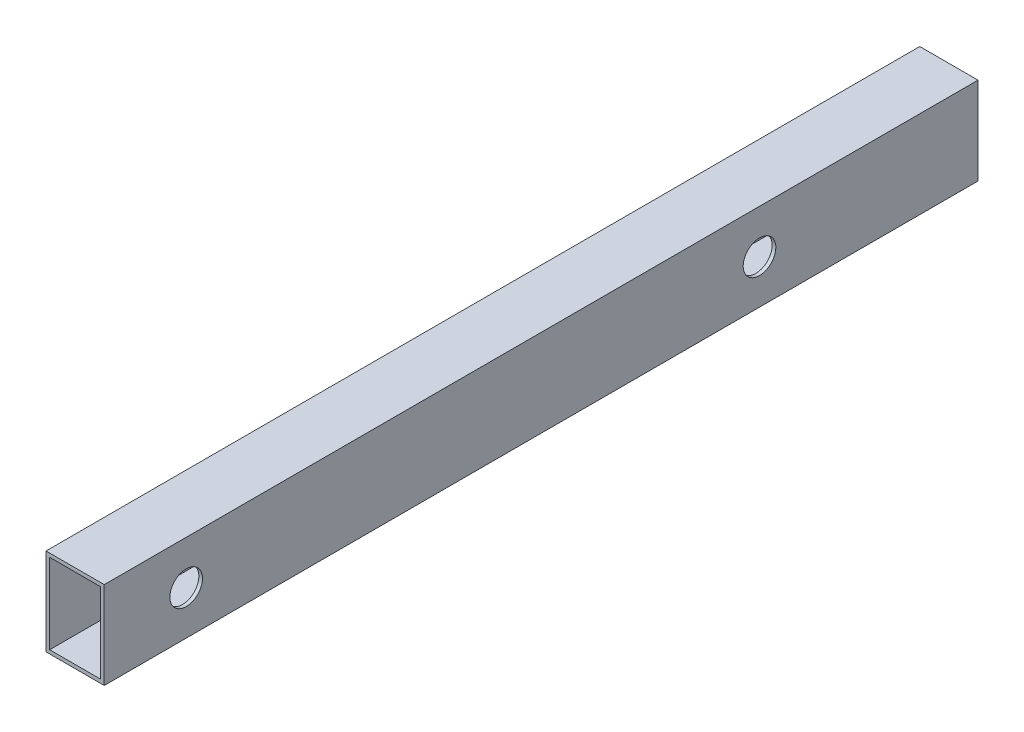
ISO-10303-21;
HEADER;
FILE_DESCRIPTION(('STEP AP214'),'2;1');
FILE_NAME('part.step','',(''),(''),'','','');
FILE_SCHEMA(('AUTOMOTIVE_DESIGN { 1 0 10303 214 1 1 1 1 }'));
ENDSEC;
DATA;
#1=APPLICATION_CONTEXT('core data for automotive mechanical design processes');
#2=APPLICATION_PROTOCOL_DEFINITION('international standard','automotive_design',2000,#1);
#3=PRODUCT_CONTEXT('',#1,'mechanical');
#4=PRODUCT('Part','Part','',(#3));
#5=PRODUCT_RELATED_PRODUCT_CATEGORY('part','',(#4));
#6=PRODUCT_DEFINITION_FORMATION('','',#4);
#7=PRODUCT_DEFINITION_CONTEXT('part definition',#1,'design');
#8=PRODUCT_DEFINITION('design','',#6,#7);
#9=PRODUCT_DEFINITION_SHAPE('','',#8);
#10=(LENGTH_UNIT() NAMED_UNIT(*) SI_UNIT(.MILLI.,.METRE.));
#11=(NAMED_UNIT(*) PLANE_ANGLE_UNIT() SI_UNIT($,.RADIAN.));
#12=(NAMED_UNIT(*) SI_UNIT($,.STERADIAN.) SOLID_ANGLE_UNIT());
#13=UNCERTAINTY_MEASURE_WITH_UNIT(LENGTH_MEASURE(1.E-05),#10,'distance_accuracy_value','');
#14=(GEOMETRIC_REPRESENTATION_CONTEXT(3) GLOBAL_UNCERTAINTY_ASSIGNED_CONTEXT((#13)) GLOBAL_UNIT_ASSIGNED_CONTEXT((#10,
#11,#12)) REPRESENTATION_CONTEXT('',''));
#15=CARTESIAN_POINT('',(0.,0.,0.));
#16=DIRECTION('',(0.,0.,1.));
#17=DIRECTION('',(1.,0.,0.));
#18=AXIS2_PLACEMENT_3D('',#15,#16,#17);
#19=CARTESIAN_POINT('',(0.,0.,762.));
#20=DIRECTION('',(0.,0.,1.));
#21=DIRECTION('',(1.,0.,0.));
#22=AXIS2_PLACEMENT_3D('',#19,#20,#21);
#23=PLANE('',#22);
#24=DIRECTION('',(0.,1.,0.));
#25=VECTOR('',#24,1.);
#26=CARTESIAN_POINT('',(25.4,38.1,762.));
#27=LINE('',#26,#25);
#28=CARTESIAN_POINT('',(25.4,-38.1,762.));
#29=VERTEX_POINT('',#28);
#30=CARTESIAN_POINT('',(25.4,38.1,762.));
#31=VERTEX_POINT('',#30);
#32=EDGE_CURVE('E138',#29,#31,#27,.T.);
#33=ORIENTED_EDGE('',*,*,#32,.T.);
#34=DIRECTION('',(-1.,0.,0.));
#35=VECTOR('',#34,1.);
#36=CARTESIAN_POINT('',(-25.4,38.1,762.));
#37=LINE('',#36,#35);
#38=CARTESIAN_POINT('',(-25.4,38.1,762.));
#39=VERTEX_POINT('',#38);
#40=EDGE_CURVE('E141',#31,#39,#37,.T.);
#41=ORIENTED_EDGE('',*,*,#40,.T.);
#42=DIRECTION('',(0.,-1.,0.));
#43=VECTOR('',#42,1.);
#44=CARTESIAN_POINT('',(-25.4,38.1,762.));
#45=LINE('',#44,#43);
#46=CARTESIAN_POINT('',(-25.3999999999999,-38.1,762.));
#47=VERTEX_POINT('',#46);
#48=EDGE_CURVE('E144',#39,#47,#45,.T.);
#49=ORIENTED_EDGE('',*,*,#48,.T.);
#50=DIRECTION('',(1.,0.,0.));
#51=VECTOR('',#50,1.);
#52=CARTESIAN_POINT('',(-25.3999999999999,-38.1,762.));
#53=LINE('',#52,#51);
#54=EDGE_CURVE('E146',#47,#29,#53,.T.);
#55=ORIENTED_EDGE('',*,*,#54,.T.);
#56=EDGE_LOOP('',(#33,#41,#49,#55));
#57=FACE_BOUND('',#56,.T.);
#58=DIRECTION('',(1.,0.,0.));
#59=VECTOR('',#58,1.);
#60=CARTESIAN_POINT('',(-22.225,-34.925,762.));
#61=LINE('',#60,#59);
#62=CARTESIAN_POINT('',(-22.225,-34.925,762.));
#63=VERTEX_POINT('',#62);
#64=CARTESIAN_POINT('',(22.225,-34.925,762.));
#65=VERTEX_POINT('',#64);
#66=EDGE_CURVE('E108',#63,#65,#61,.T.);
#67=ORIENTED_EDGE('',*,*,#66,.F.);
#68=DIRECTION('',(0.,-1.,0.));
#69=VECTOR('',#68,1.);
#70=CARTESIAN_POINT('',(-22.225,34.925,762.));
#71=LINE('',#70,#69);
#72=CARTESIAN_POINT('',(-22.225,34.925,762.));
#73=VERTEX_POINT('',#72);
#74=EDGE_CURVE('E100',#73,#63,#71,.T.);
#75=ORIENTED_EDGE('',*,*,#74,.F.);
#76=DIRECTION('',(-1.,0.,0.));
#77=VECTOR('',#76,1.);
#78=CARTESIAN_POINT('',(-22.225,34.925,762.));
#79=LINE('',#78,#77);
#80=CARTESIAN_POINT('',(22.225,34.925,762.));
#81=VERTEX_POINT('',#80);
#82=EDGE_CURVE('E122',#81,#73,#79,.T.);
#83=ORIENTED_EDGE('',*,*,#82,.F.);
#84=DIRECTION('',(0.,1.,0.));
#85=VECTOR('',#84,1.);
#86=CARTESIAN_POINT('',(22.225,34.925,762.));
#87=LINE('',#86,#85);
#88=EDGE_CURVE('E120',#65,#81,#87,.T.);
#89=ORIENTED_EDGE('',*,*,#88,.F.);
#90=EDGE_LOOP('',(#67,#75,#83,#89));
#91=FACE_BOUND('',#90,.T.);
#92=ADVANCED_FACE('F33',(#57,#91),#23,.T.);
#93=CARTESIAN_POINT('',(0.,0.,0.));
#94=DIRECTION('',(0.,0.,1.));
#95=DIRECTION('',(1.,0.,0.));
#96=AXIS2_PLACEMENT_3D('',#93,#94,#95);
#97=PLANE('',#96);
#98=DIRECTION('',(0.,1.,0.));
#99=VECTOR('',#98,1.);
#100=CARTESIAN_POINT('',(25.4,38.1,0.));
#101=LINE('',#100,#99);
#102=CARTESIAN_POINT('',(25.4,-38.1,0.));
#103=VERTEX_POINT('',#102);
#104=CARTESIAN_POINT('',(25.4,38.1,0.));
#105=VERTEX_POINT('',#104);
#106=EDGE_CURVE('E116',#103,#105,#101,.T.);
#107=ORIENTED_EDGE('',*,*,#106,.F.);
#108=DIRECTION('',(1.,0.,0.));
#109=VECTOR('',#108,1.);
#110=CARTESIAN_POINT('',(-25.3999999999999,-38.1,0.));
#111=LINE('',#110,#109);
#112=CARTESIAN_POINT('',(-25.3999999999999,-38.1,0.));
#113=VERTEX_POINT('',#112);
#114=EDGE_CURVE('E142',#113,#103,#111,.T.);
#115=ORIENTED_EDGE('',*,*,#114,.F.);
#116=DIRECTION('',(0.,-1.,0.));
#117=VECTOR('',#116,1.);
#118=CARTESIAN_POINT('',(-25.4,38.1,0.));
#119=LINE('',#118,#117);
#120=CARTESIAN_POINT('',(-25.4,38.1,0.));
#121=VERTEX_POINT('',#120);
#122=EDGE_CURVE('E153',#121,#113,#119,.T.);
#123=ORIENTED_EDGE('',*,*,#122,.F.);
#124=DIRECTION('',(-1.,0.,0.));
#125=VECTOR('',#124,1.);
#126=CARTESIAN_POINT('',(-25.4,38.1,0.));
#127=LINE('',#126,#125);
#128=EDGE_CURVE('E151',#105,#121,#127,.T.);
#129=ORIENTED_EDGE('',*,*,#128,.F.);
#130=EDGE_LOOP('',(#107,#115,#123,#129));
#131=FACE_BOUND('',#130,.T.);
#132=DIRECTION('',(0.,-1.,0.));
#133=VECTOR('',#132,1.);
#134=CARTESIAN_POINT('',(-22.225,34.925,0.));
#135=LINE('',#134,#133);
#136=CARTESIAN_POINT('',(-22.225,34.925,0.));
#137=VERTEX_POINT('',#136);
#138=CARTESIAN_POINT('',(-22.225,-34.925,0.));
#139=VERTEX_POINT('',#138);
#140=EDGE_CURVE('E58',#137,#139,#135,.T.);
#141=ORIENTED_EDGE('',*,*,#140,.T.);
#142=DIRECTION('',(1.,0.,0.));
#143=VECTOR('',#142,1.);
#144=CARTESIAN_POINT('',(-22.225,-34.925,0.));
#145=LINE('',#144,#143);
#146=CARTESIAN_POINT('',(22.225,-34.925,0.));
#147=VERTEX_POINT('',#146);
#148=EDGE_CURVE('E115',#139,#147,#145,.T.);
#149=ORIENTED_EDGE('',*,*,#148,.T.);
#150=DIRECTION('',(0.,1.,0.));
#151=VECTOR('',#150,1.);
#152=CARTESIAN_POINT('',(22.225,34.925,0.));
#153=LINE('',#152,#151);
#154=CARTESIAN_POINT('',(22.225,34.925,0.));
#155=VERTEX_POINT('',#154);
#156=EDGE_CURVE('E130',#147,#155,#153,.T.);
#157=ORIENTED_EDGE('',*,*,#156,.T.);
#158=DIRECTION('',(-1.,0.,0.));
#159=VECTOR('',#158,1.);
#160=CARTESIAN_POINT('',(-22.225,34.925,0.));
#161=LINE('',#160,#159);
#162=EDGE_CURVE('E109',#155,#137,#161,.T.);
#163=ORIENTED_EDGE('',*,*,#162,.T.);
#164=EDGE_LOOP('',(#141,#149,#157,#163));
#165=FACE_BOUND('',#164,.T.);
#166=ADVANCED_FACE('F200',(#131,#165),#97,.F.);
#167=CARTESIAN_POINT('',(25.4,38.1,762.));
#168=DIRECTION('',(-1.,0.,0.));
#169=DIRECTION('',(0.,-1.,0.));
#170=AXIS2_PLACEMENT_3D('',#167,#168,#169);
#171=PLANE('',#170);
#172=CARTESIAN_POINT('',(25.4,0.,190.549048410685));
#173=DIRECTION('',(1.,0.,0.));
#174=DIRECTION('',(0.,1.,0.));
#175=AXIS2_PLACEMENT_3D('',#172,#173,#174);
#176=CIRCLE('',#175,14.224);
#177=CARTESIAN_POINT('',(25.4,14.224,190.549048410685));
#178=VERTEX_POINT('',#177);
#179=EDGE_CURVE('E171',#178,#178,#176,.T.);
#180=ORIENTED_EDGE('',*,*,#179,.F.);
#181=EDGE_LOOP('',(#180));
#182=FACE_BOUND('',#181,.T.);
#183=CARTESIAN_POINT('',(25.4,0.,690.548048410685));
#184=DIRECTION('',(1.,0.,0.));
#185=DIRECTION('',(0.,1.,0.));
#186=AXIS2_PLACEMENT_3D('',#183,#184,#185);
#187=CIRCLE('',#186,14.2240000000001);
#188=CARTESIAN_POINT('',(25.4,14.224,690.548048410685));
#189=VERTEX_POINT('',#188);
#190=EDGE_CURVE('E176',#189,#189,#187,.T.);
#191=ORIENTED_EDGE('',*,*,#190,.F.);
#192=EDGE_LOOP('',(#191));
#193=FACE_BOUND('',#192,.T.);
#194=ORIENTED_EDGE('',*,*,#106,.T.);
#195=DIRECTION('',(0.,0.,-1.));
#196=VECTOR('',#195,1.);
#197=CARTESIAN_POINT('',(25.4,38.1,762.));
#198=LINE('',#197,#196);
#199=EDGE_CURVE('E11',#31,#105,#198,.T.);
#200=ORIENTED_EDGE('',*,*,#199,.F.);
#201=ORIENTED_EDGE('',*,*,#32,.F.);
#202=DIRECTION('',(0.,0.,-1.));
#203=VECTOR('',#202,1.);
#204=CARTESIAN_POINT('',(25.4,-38.1,762.));
#205=LINE('',#204,#203);
#206=EDGE_CURVE('E148',#29,#103,#205,.T.);
#207=ORIENTED_EDGE('',*,*,#206,.T.);
#208=EDGE_LOOP('',(#194,#200,#201,#207));
#209=FACE_BOUND('',#208,.T.);
#210=ADVANCED_FACE('F35',(#182,#193,#209),#171,.F.);
#211=CARTESIAN_POINT('',(-25.4,38.1,762.));
#212=DIRECTION('',(0.,-1.,0.));
#213=DIRECTION('',(0.,0.,-1.));
#214=AXIS2_PLACEMENT_3D('',#211,#212,#213);
#215=PLANE('',#214);
#216=ORIENTED_EDGE('',*,*,#128,.T.);
#217=DIRECTION('',(0.,0.,-1.));
#218=VECTOR('',#217,1.);
#219=CARTESIAN_POINT('',(-25.4,38.1,762.));
#220=LINE('',#219,#218);
#221=EDGE_CURVE('E42',#39,#121,#220,.T.);
#222=ORIENTED_EDGE('',*,*,#221,.F.);
#223=ORIENTED_EDGE('',*,*,#40,.F.);
#224=ORIENTED_EDGE('',*,*,#199,.T.);
#225=EDGE_LOOP('',(#216,#222,#223,#224));
#226=FACE_BOUND('',#225,.T.);
#227=ADVANCED_FACE('F226',(#226),#215,.F.);
#228=CARTESIAN_POINT('',(-25.4,38.1,762.));
#229=DIRECTION('',(1.,0.,0.));
#230=DIRECTION('',(0.,1.,0.));
#231=AXIS2_PLACEMENT_3D('',#228,#229,#230);
#232=PLANE('',#231);
#233=CARTESIAN_POINT('',(-25.4,0.,190.549048410685));
#234=DIRECTION('',(1.,0.,0.));
#235=DIRECTION('',(0.,1.,0.));
#236=AXIS2_PLACEMENT_3D('',#233,#234,#235);
#237=CIRCLE('',#236,14.224);
#238=CARTESIAN_POINT('',(-25.4,14.224,190.549048410685));
#239=VERTEX_POINT('',#238);
#240=EDGE_CURVE('E165',#239,#239,#237,.F.);
#241=ORIENTED_EDGE('',*,*,#240,.F.);
#242=EDGE_LOOP('',(#241));
#243=FACE_BOUND('',#242,.T.);
#244=CARTESIAN_POINT('',(-25.4,0.,690.548048410685));
#245=DIRECTION('',(1.,0.,0.));
#246=DIRECTION('',(0.,1.,0.));
#247=AXIS2_PLACEMENT_3D('',#244,#245,#246);
#248=CIRCLE('',#247,14.2240000000001);
#249=CARTESIAN_POINT('',(-25.4,14.224,690.548048410685));
#250=VERTEX_POINT('',#249);
#251=EDGE_CURVE('E179',#250,#250,#248,.F.);
#252=ORIENTED_EDGE('',*,*,#251,.F.);
#253=EDGE_LOOP('',(#252));
#254=FACE_BOUND('',#253,.T.);
#255=ORIENTED_EDGE('',*,*,#122,.T.);
#256=DIRECTION('',(0.,0.,-1.));
#257=VECTOR('',#256,1.);
#258=CARTESIAN_POINT('',(-25.3999999999999,-38.1,762.));
#259=LINE('',#258,#257);
#260=EDGE_CURVE('E158',#47,#113,#259,.T.);
#261=ORIENTED_EDGE('',*,*,#260,.F.);
#262=ORIENTED_EDGE('',*,*,#48,.F.);
#263=ORIENTED_EDGE('',*,*,#221,.T.);
#264=EDGE_LOOP('',(#255,#261,#262,#263));
#265=FACE_BOUND('',#264,.T.);
#266=ADVANCED_FACE('F223',(#243,#254,#265),#232,.F.);
#267=CARTESIAN_POINT('',(-25.3999999999999,-38.1,762.));
#268=DIRECTION('',(0.,1.,0.));
#269=DIRECTION('',(0.,0.,1.));
#270=AXIS2_PLACEMENT_3D('',#267,#268,#269);
#271=PLANE('',#270);
#272=ORIENTED_EDGE('',*,*,#114,.T.);
#273=ORIENTED_EDGE('',*,*,#206,.F.);
#274=ORIENTED_EDGE('',*,*,#54,.F.);
#275=ORIENTED_EDGE('',*,*,#260,.T.);
#276=EDGE_LOOP('',(#272,#273,#274,#275));
#277=FACE_BOUND('',#276,.T.);
#278=ADVANCED_FACE('F220',(#277),#271,.F.);
#279=CARTESIAN_POINT('',(-22.225,34.925,762.));
#280=DIRECTION('',(1.,0.,0.));
#281=DIRECTION('',(0.,1.,0.));
#282=AXIS2_PLACEMENT_3D('',#279,#280,#281);
#283=PLANE('',#282);
#284=CARTESIAN_POINT('',(-22.225,0.,190.549048410685));
#285=DIRECTION('',(1.,0.,0.));
#286=DIRECTION('',(0.,1.,0.));
#287=AXIS2_PLACEMENT_3D('',#284,#285,#286);
#288=CIRCLE('',#287,14.224);
#289=CARTESIAN_POINT('',(-22.225,14.224,190.549048410685));
#290=VERTEX_POINT('',#289);
#291=EDGE_CURVE('E128',#290,#290,#288,.T.);
#292=ORIENTED_EDGE('',*,*,#291,.F.);
#293=EDGE_LOOP('',(#292));
#294=FACE_BOUND('',#293,.T.);
#295=CARTESIAN_POINT('',(-22.225,0.,690.548048410685));
#296=DIRECTION('',(1.,0.,0.));
#297=DIRECTION('',(0.,1.,0.));
#298=AXIS2_PLACEMENT_3D('',#295,#296,#297);
#299=CIRCLE('',#298,14.2240000000001);
#300=CARTESIAN_POINT('',(-22.225,14.224,690.548048410685));
#301=VERTEX_POINT('',#300);
#302=EDGE_CURVE('E164',#301,#301,#299,.T.);
#303=ORIENTED_EDGE('',*,*,#302,.F.);
#304=EDGE_LOOP('',(#303));
#305=FACE_BOUND('',#304,.T.);
#306=ORIENTED_EDGE('',*,*,#140,.F.);
#307=DIRECTION('',(0.,0.,-1.));
#308=VECTOR('',#307,1.);
#309=CARTESIAN_POINT('',(-22.225,34.925,762.));
#310=LINE('',#309,#308);
#311=EDGE_CURVE('E104',#73,#137,#310,.T.);
#312=ORIENTED_EDGE('',*,*,#311,.F.);
#313=ORIENTED_EDGE('',*,*,#74,.T.);
#314=DIRECTION('',(0.,0.,-1.));
#315=VECTOR('',#314,1.);
#316=CARTESIAN_POINT('',(-22.225,-34.925,762.));
#317=LINE('',#316,#315);
#318=EDGE_CURVE('E103',#63,#139,#317,.T.);
#319=ORIENTED_EDGE('',*,*,#318,.T.);
#320=EDGE_LOOP('',(#306,#312,#313,#319));
#321=FACE_BOUND('',#320,.T.);
#322=ADVANCED_FACE('F102',(#294,#305,#321),#283,.T.);
#323=CARTESIAN_POINT('',(-22.225,-34.925,762.));
#324=DIRECTION('',(0.,1.,0.));
#325=DIRECTION('',(-1.,0.,0.));
#326=AXIS2_PLACEMENT_3D('',#323,#324,#325);
#327=PLANE('',#326);
#328=ORIENTED_EDGE('',*,*,#148,.F.);
#329=ORIENTED_EDGE('',*,*,#318,.F.);
#330=ORIENTED_EDGE('',*,*,#66,.T.);
#331=DIRECTION('',(0.,0.,-1.));
#332=VECTOR('',#331,1.);
#333=CARTESIAN_POINT('',(22.225,-34.925,762.));
#334=LINE('',#333,#332);
#335=EDGE_CURVE('E117',#65,#147,#334,.T.);
#336=ORIENTED_EDGE('',*,*,#335,.T.);
#337=EDGE_LOOP('',(#328,#329,#330,#336));
#338=FACE_BOUND('',#337,.T.);
#339=ADVANCED_FACE('F112',(#338),#327,.T.);
#340=CARTESIAN_POINT('',(22.225,34.925,762.));
#341=DIRECTION('',(-1.,0.,0.));
#342=DIRECTION('',(0.,-1.,0.));
#343=AXIS2_PLACEMENT_3D('',#340,#341,#342);
#344=PLANE('',#343);
#345=CARTESIAN_POINT('',(22.225,0.,190.549048410685));
#346=DIRECTION('',(-1.,0.,0.));
#347=DIRECTION('',(0.,-1.,0.));
#348=AXIS2_PLACEMENT_3D('',#345,#346,#347);
#349=CIRCLE('',#348,14.224);
#350=CARTESIAN_POINT('',(22.225,-14.224,190.549048410685));
#351=VERTEX_POINT('',#350);
#352=EDGE_CURVE('E37',#351,#351,#349,.T.);
#353=ORIENTED_EDGE('',*,*,#352,.F.);
#354=EDGE_LOOP('',(#353));
#355=FACE_BOUND('',#354,.T.);
#356=CARTESIAN_POINT('',(22.225,0.,690.548048410685));
#357=DIRECTION('',(-1.,0.,0.));
#358=DIRECTION('',(0.,-1.,0.));
#359=AXIS2_PLACEMENT_3D('',#356,#357,#358);
#360=CIRCLE('',#359,14.2240000000001);
#361=CARTESIAN_POINT('',(22.225,-14.2240000000001,690.548048410685));
#362=VERTEX_POINT('',#361);
#363=EDGE_CURVE('E162',#362,#362,#360,.T.);
#364=ORIENTED_EDGE('',*,*,#363,.F.);
#365=EDGE_LOOP('',(#364));
#366=FACE_BOUND('',#365,.T.);
#367=ORIENTED_EDGE('',*,*,#156,.F.);
#368=ORIENTED_EDGE('',*,*,#335,.F.);
#369=ORIENTED_EDGE('',*,*,#88,.T.);
#370=DIRECTION('',(0.,0.,-1.));
#371=VECTOR('',#370,1.);
#372=CARTESIAN_POINT('',(22.225,34.925,762.));
#373=LINE('',#372,#371);
#374=EDGE_CURVE('E50',#81,#155,#373,.T.);
#375=ORIENTED_EDGE('',*,*,#374,.T.);
#376=EDGE_LOOP('',(#367,#368,#369,#375));
#377=FACE_BOUND('',#376,.T.);
#378=ADVANCED_FACE('F192',(#355,#366,#377),#344,.T.);
#379=CARTESIAN_POINT('',(-22.225,34.925,762.));
#380=DIRECTION('',(0.,-1.,0.));
#381=DIRECTION('',(1.,0.,0.));
#382=AXIS2_PLACEMENT_3D('',#379,#380,#381);
#383=PLANE('',#382);
#384=ORIENTED_EDGE('',*,*,#162,.F.);
#385=ORIENTED_EDGE('',*,*,#374,.F.);
#386=ORIENTED_EDGE('',*,*,#82,.T.);
#387=ORIENTED_EDGE('',*,*,#311,.T.);
#388=EDGE_LOOP('',(#384,#385,#386,#387));
#389=FACE_BOUND('',#388,.T.);
#390=ADVANCED_FACE('F195',(#389),#383,.T.);
#391=CARTESIAN_POINT('',(-65.6315474223899,0.,690.548048410685));
#392=DIRECTION('',(1.,0.,0.));
#393=DIRECTION('',(0.,1.,0.));
#394=AXIS2_PLACEMENT_3D('',#391,#392,#393);
#395=CYLINDRICAL_SURFACE('',#394,14.2240000000001);
#396=ORIENTED_EDGE('',*,*,#363,.T.);
#397=EDGE_LOOP('',(#396));
#398=FACE_BOUND('',#397,.T.);
#399=ORIENTED_EDGE('',*,*,#190,.T.);
#400=EDGE_LOOP('',(#399));
#401=FACE_BOUND('',#400,.T.);
#402=ADVANCED_FACE('F202',(#398,#401),#395,.F.);
#403=CARTESIAN_POINT('',(-65.6315474223899,0.,190.549048410685));
#404=DIRECTION('',(1.,0.,0.));
#405=DIRECTION('',(0.,1.,0.));
#406=AXIS2_PLACEMENT_3D('',#403,#404,#405);
#407=CYLINDRICAL_SURFACE('',#406,14.224);
#408=ORIENTED_EDGE('',*,*,#352,.T.);
#409=EDGE_LOOP('',(#408));
#410=FACE_BOUND('',#409,.T.);
#411=ORIENTED_EDGE('',*,*,#179,.T.);
#412=EDGE_LOOP('',(#411));
#413=FACE_BOUND('',#412,.T.);
#414=ADVANCED_FACE('F189',(#410,#413),#407,.F.);
#415=ORIENTED_EDGE('',*,*,#302,.T.);
#416=EDGE_LOOP('',(#415));
#417=FACE_BOUND('',#416,.T.);
#418=ORIENTED_EDGE('',*,*,#251,.T.);
#419=EDGE_LOOP('',(#418));
#420=FACE_BOUND('',#419,.T.);
#421=ADVANCED_FACE('F208',(#417,#420),#395,.F.);
#422=ORIENTED_EDGE('',*,*,#291,.T.);
#423=EDGE_LOOP('',(#422));
#424=FACE_BOUND('',#423,.T.);
#425=ORIENTED_EDGE('',*,*,#240,.T.);
#426=EDGE_LOOP('',(#425));
#427=FACE_BOUND('',#426,.T.);
#428=ADVANCED_FACE('F254',(#424,#427),#407,.F.);
#429=CLOSED_SHELL('',(#92,#166,#210,#227,#266,#278,#322,#339,#378,#390,#402,#414,#421,#428));
#430=MANIFOLD_SOLID_BREP('B2',#429);
#431=ADVANCED_BREP_SHAPE_REPRESENTATION('',(#18,#430),#14);
#432=SHAPE_DEFINITION_REPRESENTATION(#9,#431);
ENDSEC;
END-ISO-10303-21;
